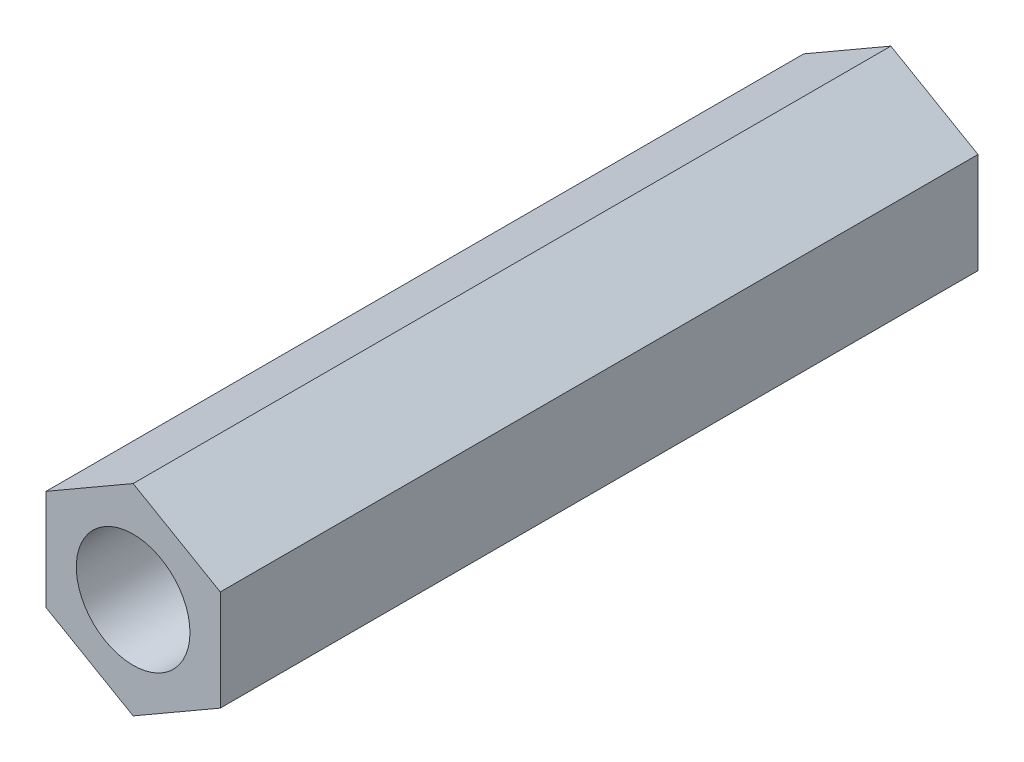
ISO-10303-21;
HEADER;
FILE_DESCRIPTION(('STEP AP214'),'2;1');
FILE_NAME('part.step','',(''),(''),'','','');
FILE_SCHEMA(('AUTOMOTIVE_DESIGN { 1 0 10303 214 1 1 1 1 }'));
ENDSEC;
DATA;
#1=APPLICATION_CONTEXT('core data for automotive mechanical design processes');
#2=APPLICATION_PROTOCOL_DEFINITION('international standard','automotive_design',2000,#1);
#3=PRODUCT_CONTEXT('',#1,'mechanical');
#4=PRODUCT('Part','Part','',(#3));
#5=PRODUCT_RELATED_PRODUCT_CATEGORY('part','',(#4));
#6=PRODUCT_DEFINITION_FORMATION('','',#4);
#7=PRODUCT_DEFINITION_CONTEXT('part definition',#1,'design');
#8=PRODUCT_DEFINITION('design','',#6,#7);
#9=PRODUCT_DEFINITION_SHAPE('','',#8);
#10=(LENGTH_UNIT() NAMED_UNIT(*) SI_UNIT(.MILLI.,.METRE.));
#11=(NAMED_UNIT(*) PLANE_ANGLE_UNIT() SI_UNIT($,.RADIAN.));
#12=(NAMED_UNIT(*) SI_UNIT($,.STERADIAN.) SOLID_ANGLE_UNIT());
#13=UNCERTAINTY_MEASURE_WITH_UNIT(LENGTH_MEASURE(1.E-05),#10,'distance_accuracy_value','');
#14=(GEOMETRIC_REPRESENTATION_CONTEXT(3) GLOBAL_UNCERTAINTY_ASSIGNED_CONTEXT((#13)) GLOBAL_UNIT_ASSIGNED_CONTEXT((#10,
#11,#12)) REPRESENTATION_CONTEXT('',''));
#15=CARTESIAN_POINT('',(0.,0.,0.));
#16=DIRECTION('',(0.,0.,1.));
#17=DIRECTION('',(1.,0.,0.));
#18=AXIS2_PLACEMENT_3D('',#15,#16,#17);
#19=CARTESIAN_POINT('',(0.,0.,20.));
#20=DIRECTION('',(0.,0.,1.));
#21=DIRECTION('',(1.,0.,0.));
#22=AXIS2_PLACEMENT_3D('',#19,#20,#21);
#23=PLANE('',#22);
#24=DIRECTION('',(0.,1.,0.));
#25=VECTOR('',#24,1.);
#26=CARTESIAN_POINT('',(2.3,-1.32790561913614,20.));
#27=LINE('',#26,#25);
#28=CARTESIAN_POINT('',(2.3,-1.32790561913614,20.));
#29=VERTEX_POINT('',#28);
#30=CARTESIAN_POINT('',(2.3,1.32790561913614,20.));
#31=VERTEX_POINT('',#30);
#32=EDGE_CURVE('E132',#29,#31,#27,.T.);
#33=ORIENTED_EDGE('',*,*,#32,.T.);
#34=DIRECTION('',(-0.866025403784439,0.5,0.));
#35=VECTOR('',#34,1.);
#36=CARTESIAN_POINT('',(2.3,1.32790561913614,20.));
#37=LINE('',#36,#35);
#38=CARTESIAN_POINT('',(0.,2.65581123827228,20.));
#39=VERTEX_POINT('',#38);
#40=EDGE_CURVE('E90',#31,#39,#37,.T.);
#41=ORIENTED_EDGE('',*,*,#40,.T.);
#42=DIRECTION('',(-0.866025403784439,-0.5,0.));
#43=VECTOR('',#42,1.);
#44=CARTESIAN_POINT('',(0.,2.65581123827228,20.));
#45=LINE('',#44,#43);
#46=CARTESIAN_POINT('',(-2.3,1.32790561913614,20.));
#47=VERTEX_POINT('',#46);
#48=EDGE_CURVE('E103',#39,#47,#45,.T.);
#49=ORIENTED_EDGE('',*,*,#48,.T.);
#50=DIRECTION('',(0.,-1.,0.));
#51=VECTOR('',#50,1.);
#52=CARTESIAN_POINT('',(-2.3,1.32790561913614,20.));
#53=LINE('',#52,#51);
#54=CARTESIAN_POINT('',(-2.3,-1.32790561913614,20.));
#55=VERTEX_POINT('',#54);
#56=EDGE_CURVE('E97',#47,#55,#53,.T.);
#57=ORIENTED_EDGE('',*,*,#56,.T.);
#58=DIRECTION('',(0.866025403784439,-0.5,0.));
#59=VECTOR('',#58,1.);
#60=CARTESIAN_POINT('',(-2.3,-1.32790561913614,20.));
#61=LINE('',#60,#59);
#62=CARTESIAN_POINT('',(0.,-2.65581123827228,20.));
#63=VERTEX_POINT('',#62);
#64=EDGE_CURVE('E101',#55,#63,#61,.T.);
#65=ORIENTED_EDGE('',*,*,#64,.T.);
#66=DIRECTION('',(0.866025403784439,0.5,0.));
#67=VECTOR('',#66,1.);
#68=CARTESIAN_POINT('',(0.,-2.65581123827228,20.));
#69=LINE('',#68,#67);
#70=EDGE_CURVE('E53',#63,#29,#69,.T.);
#71=ORIENTED_EDGE('',*,*,#70,.T.);
#72=EDGE_LOOP('',(#33,#41,#49,#57,#65,#71));
#73=FACE_BOUND('',#72,.T.);
#74=CARTESIAN_POINT('',(0.,0.,20.));
#75=DIRECTION('',(0.,0.,1.));
#76=DIRECTION('',(1.,0.,0.));
#77=AXIS2_PLACEMENT_3D('',#74,#75,#76);
#78=CIRCLE('',#77,1.5);
#79=CARTESIAN_POINT('',(1.5,0.,20.));
#80=VERTEX_POINT('',#79);
#81=EDGE_CURVE('E125',#80,#80,#78,.T.);
#82=ORIENTED_EDGE('',*,*,#81,.F.);
#83=EDGE_LOOP('',(#82));
#84=FACE_BOUND('',#83,.T.);
#85=ADVANCED_FACE('F36',(#73,#84),#23,.T.);
#86=CARTESIAN_POINT('',(0.,0.,0.));
#87=DIRECTION('',(0.,0.,1.));
#88=DIRECTION('',(1.,0.,0.));
#89=AXIS2_PLACEMENT_3D('',#86,#87,#88);
#90=PLANE('',#89);
#91=DIRECTION('',(0.,1.,0.));
#92=VECTOR('',#91,1.);
#93=CARTESIAN_POINT('',(2.3,-1.32790561913614,0.));
#94=LINE('',#93,#92);
#95=CARTESIAN_POINT('',(2.3,-1.32790561913614,0.));
#96=VERTEX_POINT('',#95);
#97=CARTESIAN_POINT('',(2.3,1.32790561913614,0.));
#98=VERTEX_POINT('',#97);
#99=EDGE_CURVE('E121',#96,#98,#94,.T.);
#100=ORIENTED_EDGE('',*,*,#99,.F.);
#101=DIRECTION('',(0.866025403784439,0.5,0.));
#102=VECTOR('',#101,1.);
#103=CARTESIAN_POINT('',(0.,-2.65581123827228,0.));
#104=LINE('',#103,#102);
#105=CARTESIAN_POINT('',(0.,-2.65581123827228,0.));
#106=VERTEX_POINT('',#105);
#107=EDGE_CURVE('E82',#106,#96,#104,.T.);
#108=ORIENTED_EDGE('',*,*,#107,.F.);
#109=DIRECTION('',(0.866025403784439,-0.5,0.));
#110=VECTOR('',#109,1.);
#111=CARTESIAN_POINT('',(-2.3,-1.32790561913614,0.));
#112=LINE('',#111,#110);
#113=CARTESIAN_POINT('',(-2.3,-1.32790561913614,0.));
#114=VERTEX_POINT('',#113);
#115=EDGE_CURVE('E76',#114,#106,#112,.T.);
#116=ORIENTED_EDGE('',*,*,#115,.F.);
#117=DIRECTION('',(0.,-1.,0.));
#118=VECTOR('',#117,1.);
#119=CARTESIAN_POINT('',(-2.3,1.32790561913614,0.));
#120=LINE('',#119,#118);
#121=CARTESIAN_POINT('',(-2.3,1.32790561913614,0.));
#122=VERTEX_POINT('',#121);
#123=EDGE_CURVE('E111',#122,#114,#120,.T.);
#124=ORIENTED_EDGE('',*,*,#123,.F.);
#125=DIRECTION('',(-0.866025403784439,-0.5,0.));
#126=VECTOR('',#125,1.);
#127=CARTESIAN_POINT('',(0.,2.65581123827228,0.));
#128=LINE('',#127,#126);
#129=CARTESIAN_POINT('',(0.,2.65581123827228,0.));
#130=VERTEX_POINT('',#129);
#131=EDGE_CURVE('E127',#130,#122,#128,.T.);
#132=ORIENTED_EDGE('',*,*,#131,.F.);
#133=DIRECTION('',(-0.866025403784439,0.5,0.));
#134=VECTOR('',#133,1.);
#135=CARTESIAN_POINT('',(2.3,1.32790561913614,0.));
#136=LINE('',#135,#134);
#137=EDGE_CURVE('E124',#98,#130,#136,.T.);
#138=ORIENTED_EDGE('',*,*,#137,.F.);
#139=EDGE_LOOP('',(#100,#108,#116,#124,#132,#138));
#140=FACE_BOUND('',#139,.T.);
#141=CARTESIAN_POINT('',(0.,0.,0.));
#142=DIRECTION('',(0.,0.,1.));
#143=DIRECTION('',(1.,0.,0.));
#144=AXIS2_PLACEMENT_3D('',#141,#142,#143);
#145=CIRCLE('',#144,1.5);
#146=CARTESIAN_POINT('',(1.5,0.,0.));
#147=VERTEX_POINT('',#146);
#148=EDGE_CURVE('E243',#147,#147,#145,.T.);
#149=ORIENTED_EDGE('',*,*,#148,.T.);
#150=EDGE_LOOP('',(#149));
#151=FACE_BOUND('',#150,.T.);
#152=ADVANCED_FACE('F141',(#140,#151),#90,.F.);
#153=CARTESIAN_POINT('',(2.3,-1.32790561913614,20.));
#154=DIRECTION('',(-1.,0.,0.));
#155=DIRECTION('',(0.,-1.,0.));
#156=AXIS2_PLACEMENT_3D('',#153,#154,#155);
#157=PLANE('',#156);
#158=ORIENTED_EDGE('',*,*,#99,.T.);
#159=DIRECTION('',(0.,0.,-1.));
#160=VECTOR('',#159,1.);
#161=CARTESIAN_POINT('',(2.3,1.32790561913614,20.));
#162=LINE('',#161,#160);
#163=EDGE_CURVE('E11',#31,#98,#162,.T.);
#164=ORIENTED_EDGE('',*,*,#163,.F.);
#165=ORIENTED_EDGE('',*,*,#32,.F.);
#166=DIRECTION('',(0.,0.,-1.));
#167=VECTOR('',#166,1.);
#168=CARTESIAN_POINT('',(2.3,-1.32790561913614,20.));
#169=LINE('',#168,#167);
#170=EDGE_CURVE('E117',#29,#96,#169,.T.);
#171=ORIENTED_EDGE('',*,*,#170,.T.);
#172=EDGE_LOOP('',(#158,#164,#165,#171));
#173=FACE_BOUND('',#172,.T.);
#174=ADVANCED_FACE('F38',(#173),#157,.F.);
#175=CARTESIAN_POINT('',(2.3,1.32790561913614,20.));
#176=DIRECTION('',(-0.5,-0.866025403784439,0.));
#177=DIRECTION('',(0.866025403784439,-0.5,0.));
#178=AXIS2_PLACEMENT_3D('',#175,#176,#177);
#179=PLANE('',#178);
#180=ORIENTED_EDGE('',*,*,#137,.T.);
#181=DIRECTION('',(0.,0.,-1.));
#182=VECTOR('',#181,1.);
#183=CARTESIAN_POINT('',(0.,2.65581123827228,20.));
#184=LINE('',#183,#182);
#185=EDGE_CURVE('E45',#39,#130,#184,.T.);
#186=ORIENTED_EDGE('',*,*,#185,.F.);
#187=ORIENTED_EDGE('',*,*,#40,.F.);
#188=ORIENTED_EDGE('',*,*,#163,.T.);
#189=EDGE_LOOP('',(#180,#186,#187,#188));
#190=FACE_BOUND('',#189,.T.);
#191=ADVANCED_FACE('F166',(#190),#179,.F.);
#192=CARTESIAN_POINT('',(0.,2.65581123827228,20.));
#193=DIRECTION('',(0.5,-0.866025403784439,0.));
#194=DIRECTION('',(0.866025403784439,0.5,0.));
#195=AXIS2_PLACEMENT_3D('',#192,#193,#194);
#196=PLANE('',#195);
#197=ORIENTED_EDGE('',*,*,#131,.T.);
#198=DIRECTION('',(0.,0.,-1.));
#199=VECTOR('',#198,1.);
#200=CARTESIAN_POINT('',(-2.3,1.32790561913614,20.));
#201=LINE('',#200,#199);
#202=EDGE_CURVE('E112',#47,#122,#201,.T.);
#203=ORIENTED_EDGE('',*,*,#202,.F.);
#204=ORIENTED_EDGE('',*,*,#48,.F.);
#205=ORIENTED_EDGE('',*,*,#185,.T.);
#206=EDGE_LOOP('',(#197,#203,#204,#205));
#207=FACE_BOUND('',#206,.T.);
#208=ADVANCED_FACE('F138',(#207),#196,.F.);
#209=CARTESIAN_POINT('',(-2.3,1.32790561913614,20.));
#210=DIRECTION('',(1.,0.,0.));
#211=DIRECTION('',(0.,0.,-1.));
#212=AXIS2_PLACEMENT_3D('',#209,#210,#211);
#213=PLANE('',#212);
#214=ORIENTED_EDGE('',*,*,#123,.T.);
#215=DIRECTION('',(0.,0.,-1.));
#216=VECTOR('',#215,1.);
#217=CARTESIAN_POINT('',(-2.3,-1.32790561913614,20.));
#218=LINE('',#217,#216);
#219=EDGE_CURVE('E108',#55,#114,#218,.T.);
#220=ORIENTED_EDGE('',*,*,#219,.F.);
#221=ORIENTED_EDGE('',*,*,#56,.F.);
#222=ORIENTED_EDGE('',*,*,#202,.T.);
#223=EDGE_LOOP('',(#214,#220,#221,#222));
#224=FACE_BOUND('',#223,.T.);
#225=ADVANCED_FACE('F109',(#224),#213,.F.);
#226=CARTESIAN_POINT('',(-2.3,-1.32790561913614,20.));
#227=DIRECTION('',(0.5,0.866025403784438,0.));
#228=DIRECTION('',(-0.866025403784439,0.5,0.));
#229=AXIS2_PLACEMENT_3D('',#226,#227,#228);
#230=PLANE('',#229);
#231=ORIENTED_EDGE('',*,*,#115,.T.);
#232=DIRECTION('',(0.,0.,-1.));
#233=VECTOR('',#232,1.);
#234=CARTESIAN_POINT('',(0.,-2.65581123827228,20.));
#235=LINE('',#234,#233);
#236=EDGE_CURVE('E113',#63,#106,#235,.T.);
#237=ORIENTED_EDGE('',*,*,#236,.F.);
#238=ORIENTED_EDGE('',*,*,#64,.F.);
#239=ORIENTED_EDGE('',*,*,#219,.T.);
#240=EDGE_LOOP('',(#231,#237,#238,#239));
#241=FACE_BOUND('',#240,.T.);
#242=ADVANCED_FACE('F115',(#241),#230,.F.);
#243=CARTESIAN_POINT('',(0.,-2.65581123827228,20.));
#244=DIRECTION('',(-0.5,0.866025403784439,0.));
#245=DIRECTION('',(-0.866025403784439,-0.5,0.));
#246=AXIS2_PLACEMENT_3D('',#243,#244,#245);
#247=PLANE('',#246);
#248=ORIENTED_EDGE('',*,*,#107,.T.);
#249=ORIENTED_EDGE('',*,*,#170,.F.);
#250=ORIENTED_EDGE('',*,*,#70,.F.);
#251=ORIENTED_EDGE('',*,*,#236,.T.);
#252=EDGE_LOOP('',(#248,#249,#250,#251));
#253=FACE_BOUND('',#252,.T.);
#254=ADVANCED_FACE('F146',(#253),#247,.F.);
#255=CARTESIAN_POINT('',(0.,0.,20.));
#256=DIRECTION('',(0.,0.,-1.));
#257=DIRECTION('',(-1.,0.,0.));
#258=AXIS2_PLACEMENT_3D('',#255,#256,#257);
#259=CYLINDRICAL_SURFACE('',#258,1.5);
#260=ORIENTED_EDGE('',*,*,#81,.T.);
#261=EDGE_LOOP('',(#260));
#262=FACE_BOUND('',#261,.T.);
#263=ORIENTED_EDGE('',*,*,#148,.F.);
#264=EDGE_LOOP('',(#263));
#265=FACE_BOUND('',#264,.T.);
#266=ADVANCED_FACE('F148',(#262,#265),#259,.F.);
#267=CLOSED_SHELL('',(#85,#152,#174,#191,#208,#225,#242,#254,#266));
#268=MANIFOLD_SOLID_BREP('B2',#267);
#269=ADVANCED_BREP_SHAPE_REPRESENTATION('',(#18,#268),#14);
#270=SHAPE_DEFINITION_REPRESENTATION(#9,#269);
ENDSEC;
END-ISO-10303-21;
